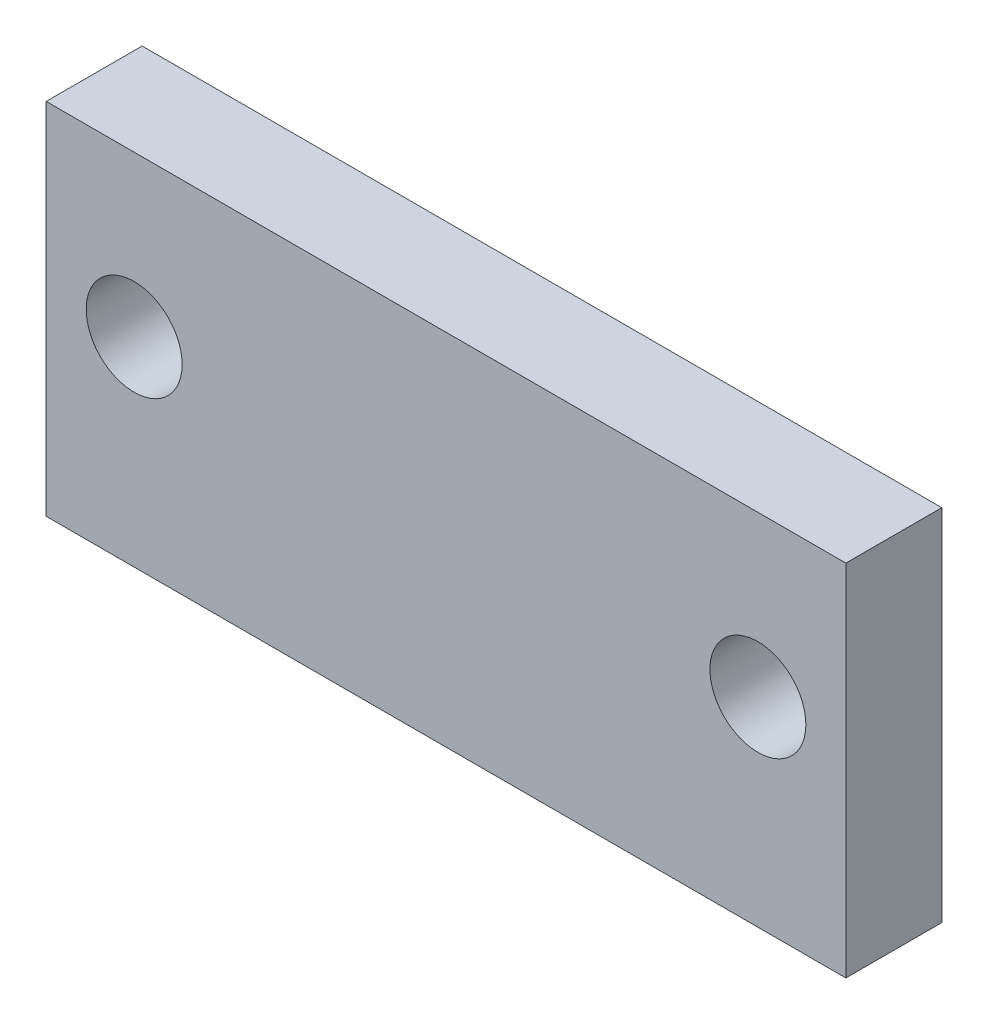
ISO-10303-21;
HEADER;
FILE_DESCRIPTION(('STEP AP214'),'2;1');
FILE_NAME('part.step','',(''),(''),'','','');
FILE_SCHEMA(('AUTOMOTIVE_DESIGN { 1 0 10303 214 1 1 1 1 }'));
ENDSEC;
DATA;
#1=APPLICATION_CONTEXT('core data for automotive mechanical design processes');
#2=APPLICATION_PROTOCOL_DEFINITION('international standard','automotive_design',2000,#1);
#3=PRODUCT_CONTEXT('',#1,'mechanical');
#4=PRODUCT('Part','Part','',(#3));
#5=PRODUCT_RELATED_PRODUCT_CATEGORY('part','',(#4));
#6=PRODUCT_DEFINITION_FORMATION('','',#4);
#7=PRODUCT_DEFINITION_CONTEXT('part definition',#1,'design');
#8=PRODUCT_DEFINITION('design','',#6,#7);
#9=PRODUCT_DEFINITION_SHAPE('','',#8);
#10=(LENGTH_UNIT() NAMED_UNIT(*) SI_UNIT(.MILLI.,.METRE.));
#11=(NAMED_UNIT(*) PLANE_ANGLE_UNIT() SI_UNIT($,.RADIAN.));
#12=(NAMED_UNIT(*) SI_UNIT($,.STERADIAN.) SOLID_ANGLE_UNIT());
#13=UNCERTAINTY_MEASURE_WITH_UNIT(LENGTH_MEASURE(1.E-05),#10,'distance_accuracy_value','');
#14=(GEOMETRIC_REPRESENTATION_CONTEXT(3) GLOBAL_UNCERTAINTY_ASSIGNED_CONTEXT((#13)) GLOBAL_UNIT_ASSIGNED_CONTEXT((#10,
#11,#12)) REPRESENTATION_CONTEXT('',''));
#15=CARTESIAN_POINT('',(0.,0.,0.));
#16=DIRECTION('',(0.,0.,1.));
#17=DIRECTION('',(1.,0.,0.));
#18=AXIS2_PLACEMENT_3D('',#15,#16,#17);
#19=CARTESIAN_POINT('',(12.5,-5.61683006535948,3.));
#20=DIRECTION('',(-1.,0.,0.));
#21=DIRECTION('',(0.,0.,1.));
#22=AXIS2_PLACEMENT_3D('',#19,#20,#21);
#23=PLANE('',#22);
#24=DIRECTION('',(0.,1.,0.));
#25=VECTOR('',#24,1.);
#26=CARTESIAN_POINT('',(12.5,-5.61683006535948,0.));
#27=LINE('',#26,#25);
#28=CARTESIAN_POINT('',(12.5,-5.61683006535948,0.));
#29=VERTEX_POINT('',#28);
#30=CARTESIAN_POINT('',(12.5,5.61683006535948,0.));
#31=VERTEX_POINT('',#30);
#32=EDGE_CURVE('E100',#29,#31,#27,.T.);
#33=ORIENTED_EDGE('',*,*,#32,.T.);
#34=DIRECTION('',(0.,0.,-1.));
#35=VECTOR('',#34,1.);
#36=CARTESIAN_POINT('',(12.5,5.61683006535948,3.));
#37=LINE('',#36,#35);
#38=CARTESIAN_POINT('',(12.5,5.61683006535948,3.));
#39=VERTEX_POINT('',#38);
#40=EDGE_CURVE('E11',#39,#31,#37,.T.);
#41=ORIENTED_EDGE('',*,*,#40,.F.);
#42=DIRECTION('',(0.,1.,0.));
#43=VECTOR('',#42,1.);
#44=CARTESIAN_POINT('',(12.5,-5.61683006535948,3.));
#45=LINE('',#44,#43);
#46=CARTESIAN_POINT('',(12.5,-5.61683006535948,3.));
#47=VERTEX_POINT('',#46);
#48=EDGE_CURVE('E88',#47,#39,#45,.T.);
#49=ORIENTED_EDGE('',*,*,#48,.F.);
#50=DIRECTION('',(0.,0.,-1.));
#51=VECTOR('',#50,1.);
#52=CARTESIAN_POINT('',(12.5,-5.61683006535948,3.));
#53=LINE('',#52,#51);
#54=EDGE_CURVE('E96',#47,#29,#53,.T.);
#55=ORIENTED_EDGE('',*,*,#54,.T.);
#56=EDGE_LOOP('',(#33,#41,#49,#55));
#57=FACE_BOUND('',#56,.T.);
#58=ADVANCED_FACE('F37',(#57),#23,.F.);
#59=CARTESIAN_POINT('',(-12.5,5.61683006535948,3.));
#60=DIRECTION('',(0.,-1.,0.));
#61=DIRECTION('',(0.,0.,-1.));
#62=AXIS2_PLACEMENT_3D('',#59,#60,#61);
#63=PLANE('',#62);
#64=DIRECTION('',(-1.,0.,0.));
#65=VECTOR('',#64,1.);
#66=CARTESIAN_POINT('',(-12.5,5.61683006535948,0.));
#67=LINE('',#66,#65);
#68=CARTESIAN_POINT('',(-12.5,5.61683006535948,0.));
#69=VERTEX_POINT('',#68);
#70=EDGE_CURVE('E92',#31,#69,#67,.T.);
#71=ORIENTED_EDGE('',*,*,#70,.T.);
#72=DIRECTION('',(0.,0.,-1.));
#73=VECTOR('',#72,1.);
#74=CARTESIAN_POINT('',(-12.5,5.61683006535948,3.));
#75=LINE('',#74,#73);
#76=CARTESIAN_POINT('',(-12.5,5.61683006535948,3.));
#77=VERTEX_POINT('',#76);
#78=EDGE_CURVE('E45',#77,#69,#75,.T.);
#79=ORIENTED_EDGE('',*,*,#78,.F.);
#80=DIRECTION('',(-1.,0.,0.));
#81=VECTOR('',#80,1.);
#82=CARTESIAN_POINT('',(-12.5,5.61683006535948,3.));
#83=LINE('',#82,#81);
#84=EDGE_CURVE('E83',#39,#77,#83,.T.);
#85=ORIENTED_EDGE('',*,*,#84,.F.);
#86=ORIENTED_EDGE('',*,*,#40,.T.);
#87=EDGE_LOOP('',(#71,#79,#85,#86));
#88=FACE_BOUND('',#87,.T.);
#89=ADVANCED_FACE('F91',(#88),#63,.F.);
#90=CARTESIAN_POINT('',(-12.5,-5.61683006535948,3.));
#91=DIRECTION('',(1.,0.,0.));
#92=DIRECTION('',(0.,0.,-1.));
#93=AXIS2_PLACEMENT_3D('',#90,#91,#92);
#94=PLANE('',#93);
#95=DIRECTION('',(0.,-1.,0.));
#96=VECTOR('',#95,1.);
#97=CARTESIAN_POINT('',(-12.5,-5.61683006535948,0.));
#98=LINE('',#97,#96);
#99=CARTESIAN_POINT('',(-12.5,-5.61683006535948,0.));
#100=VERTEX_POINT('',#99);
#101=EDGE_CURVE('E70',#69,#100,#98,.T.);
#102=ORIENTED_EDGE('',*,*,#101,.T.);
#103=DIRECTION('',(0.,0.,-1.));
#104=VECTOR('',#103,1.);
#105=CARTESIAN_POINT('',(-12.5,-5.61683006535948,3.));
#106=LINE('',#105,#104);
#107=CARTESIAN_POINT('',(-12.5,-5.61683006535948,3.));
#108=VERTEX_POINT('',#107);
#109=EDGE_CURVE('E93',#108,#100,#106,.T.);
#110=ORIENTED_EDGE('',*,*,#109,.F.);
#111=DIRECTION('',(0.,-1.,0.));
#112=VECTOR('',#111,1.);
#113=CARTESIAN_POINT('',(-12.5,-5.61683006535948,3.));
#114=LINE('',#113,#112);
#115=EDGE_CURVE('E86',#77,#108,#114,.T.);
#116=ORIENTED_EDGE('',*,*,#115,.F.);
#117=ORIENTED_EDGE('',*,*,#78,.T.);
#118=EDGE_LOOP('',(#102,#110,#116,#117));
#119=FACE_BOUND('',#118,.T.);
#120=ADVANCED_FACE('F94',(#119),#94,.F.);
#121=CARTESIAN_POINT('',(-12.5,-5.61683006535948,3.));
#122=DIRECTION('',(0.,1.,0.));
#123=DIRECTION('',(0.,0.,1.));
#124=AXIS2_PLACEMENT_3D('',#121,#122,#123);
#125=PLANE('',#124);
#126=DIRECTION('',(1.,0.,0.));
#127=VECTOR('',#126,1.);
#128=CARTESIAN_POINT('',(-12.5,-5.61683006535948,0.));
#129=LINE('',#128,#127);
#130=EDGE_CURVE('E76',#100,#29,#129,.T.);
#131=ORIENTED_EDGE('',*,*,#130,.T.);
#132=ORIENTED_EDGE('',*,*,#54,.F.);
#133=DIRECTION('',(1.,0.,0.));
#134=VECTOR('',#133,1.);
#135=CARTESIAN_POINT('',(-12.5,-5.61683006535948,3.));
#136=LINE('',#135,#134);
#137=EDGE_CURVE('E53',#108,#47,#136,.T.);
#138=ORIENTED_EDGE('',*,*,#137,.F.);
#139=ORIENTED_EDGE('',*,*,#109,.T.);
#140=EDGE_LOOP('',(#131,#132,#138,#139));
#141=FACE_BOUND('',#140,.T.);
#142=ADVANCED_FACE('F108',(#141),#125,.F.);
#143=CARTESIAN_POINT('',(0.,0.,3.));
#144=DIRECTION('',(0.,0.,-1.));
#145=DIRECTION('',(-1.,0.,0.));
#146=AXIS2_PLACEMENT_3D('',#143,#144,#145);
#147=PLANE('',#146);
#148=CARTESIAN_POINT('',(-9.75,0.616830065359477,3.));
#149=DIRECTION('',(0.,0.,1.));
#150=DIRECTION('',(1.,0.,0.));
#151=AXIS2_PLACEMENT_3D('',#148,#149,#150);
#152=CIRCLE('',#151,1.5);
#153=CARTESIAN_POINT('',(-8.25,0.616830065359477,3.));
#154=VERTEX_POINT('',#153);
#155=EDGE_CURVE('E120',#154,#154,#152,.T.);
#156=ORIENTED_EDGE('',*,*,#155,.F.);
#157=EDGE_LOOP('',(#156));
#158=FACE_BOUND('',#157,.T.);
#159=CARTESIAN_POINT('',(9.75,0.616830065359477,3.));
#160=DIRECTION('',(0.,0.,1.));
#161=DIRECTION('',(1.,0.,0.));
#162=AXIS2_PLACEMENT_3D('',#159,#160,#161);
#163=CIRCLE('',#162,1.5);
#164=CARTESIAN_POINT('',(11.25,0.616830065359477,3.));
#165=VERTEX_POINT('',#164);
#166=EDGE_CURVE('E117',#165,#165,#163,.T.);
#167=ORIENTED_EDGE('',*,*,#166,.F.);
#168=EDGE_LOOP('',(#167));
#169=FACE_BOUND('',#168,.T.);
#170=ORIENTED_EDGE('',*,*,#48,.T.);
#171=ORIENTED_EDGE('',*,*,#84,.T.);
#172=ORIENTED_EDGE('',*,*,#115,.T.);
#173=ORIENTED_EDGE('',*,*,#137,.T.);
#174=EDGE_LOOP('',(#170,#171,#172,#173));
#175=FACE_BOUND('',#174,.T.);
#176=ADVANCED_FACE('F84',(#158,#169,#175),#147,.F.);
#177=CARTESIAN_POINT('',(0.,0.,0.));
#178=DIRECTION('',(0.,0.,-1.));
#179=DIRECTION('',(-1.,0.,0.));
#180=AXIS2_PLACEMENT_3D('',#177,#178,#179);
#181=PLANE('',#180);
#182=CARTESIAN_POINT('',(-9.75,0.616830065359477,0.));
#183=DIRECTION('',(0.,0.,1.));
#184=DIRECTION('',(1.,0.,0.));
#185=AXIS2_PLACEMENT_3D('',#182,#183,#184);
#186=CIRCLE('',#185,1.5);
#187=CARTESIAN_POINT('',(-8.25,0.616830065359477,0.));
#188=VERTEX_POINT('',#187);
#189=EDGE_CURVE('E103',#188,#188,#186,.T.);
#190=ORIENTED_EDGE('',*,*,#189,.T.);
#191=EDGE_LOOP('',(#190));
#192=FACE_BOUND('',#191,.T.);
#193=CARTESIAN_POINT('',(9.75,0.616830065359477,0.));
#194=DIRECTION('',(0.,0.,1.));
#195=DIRECTION('',(1.,0.,0.));
#196=AXIS2_PLACEMENT_3D('',#193,#194,#195);
#197=CIRCLE('',#196,1.5);
#198=CARTESIAN_POINT('',(11.25,0.616830065359477,0.));
#199=VERTEX_POINT('',#198);
#200=EDGE_CURVE('E114',#199,#199,#197,.T.);
#201=ORIENTED_EDGE('',*,*,#200,.T.);
#202=EDGE_LOOP('',(#201));
#203=FACE_BOUND('',#202,.T.);
#204=ORIENTED_EDGE('',*,*,#32,.F.);
#205=ORIENTED_EDGE('',*,*,#130,.F.);
#206=ORIENTED_EDGE('',*,*,#101,.F.);
#207=ORIENTED_EDGE('',*,*,#70,.F.);
#208=EDGE_LOOP('',(#204,#205,#206,#207));
#209=FACE_BOUND('',#208,.T.);
#210=ADVANCED_FACE('F111',(#192,#203,#209),#181,.T.);
#211=CARTESIAN_POINT('',(9.75,0.616830065359477,0.));
#212=DIRECTION('',(0.,0.,1.));
#213=DIRECTION('',(1.,0.,0.));
#214=AXIS2_PLACEMENT_3D('',#211,#212,#213);
#215=CYLINDRICAL_SURFACE('',#214,1.5);
#216=ORIENTED_EDGE('',*,*,#200,.F.);
#217=EDGE_LOOP('',(#216));
#218=FACE_BOUND('',#217,.T.);
#219=ORIENTED_EDGE('',*,*,#166,.T.);
#220=EDGE_LOOP('',(#219));
#221=FACE_BOUND('',#220,.T.);
#222=ADVANCED_FACE('F131',(#218,#221),#215,.F.);
#223=CARTESIAN_POINT('',(-9.75,0.616830065359477,0.));
#224=DIRECTION('',(0.,0.,1.));
#225=DIRECTION('',(1.,0.,0.));
#226=AXIS2_PLACEMENT_3D('',#223,#224,#225);
#227=CYLINDRICAL_SURFACE('',#226,1.5);
#228=ORIENTED_EDGE('',*,*,#189,.F.);
#229=EDGE_LOOP('',(#228));
#230=FACE_BOUND('',#229,.T.);
#231=ORIENTED_EDGE('',*,*,#155,.T.);
#232=EDGE_LOOP('',(#231));
#233=FACE_BOUND('',#232,.T.);
#234=ADVANCED_FACE('F128',(#230,#233),#227,.F.);
#235=CLOSED_SHELL('',(#58,#89,#120,#142,#176,#210,#222,#234));
#236=MANIFOLD_SOLID_BREP('B2',#235);
#237=ADVANCED_BREP_SHAPE_REPRESENTATION('',(#18,#236),#14);
#238=SHAPE_DEFINITION_REPRESENTATION(#9,#237);
ENDSEC;
END-ISO-10303-21;
